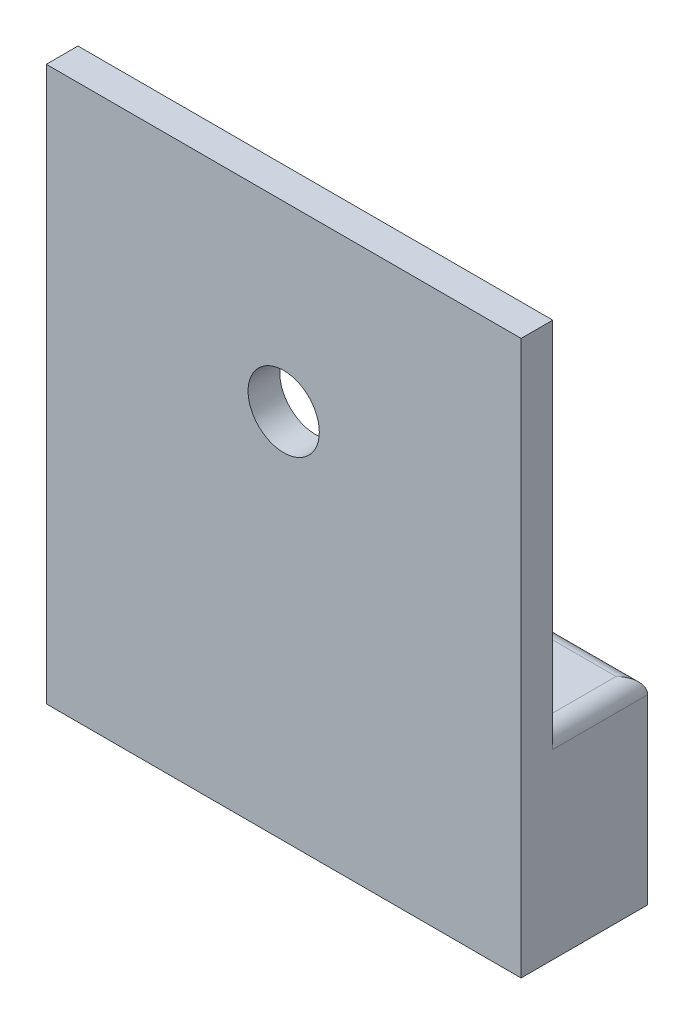
ISO-10303-21;
HEADER;
FILE_DESCRIPTION(('STEP AP214'),'2;1');
FILE_NAME('part.step','',(''),(''),'','','');
FILE_SCHEMA(('AUTOMOTIVE_DESIGN { 1 0 10303 214 1 1 1 1 }'));
ENDSEC;
DATA;
#1=APPLICATION_CONTEXT('core data for automotive mechanical design processes');
#2=APPLICATION_PROTOCOL_DEFINITION('international standard','automotive_design',2000,#1);
#3=PRODUCT_CONTEXT('',#1,'mechanical');
#4=PRODUCT('Part','Part','',(#3));
#5=PRODUCT_RELATED_PRODUCT_CATEGORY('part','',(#4));
#6=PRODUCT_DEFINITION_FORMATION('','',#4);
#7=PRODUCT_DEFINITION_CONTEXT('part definition',#1,'design');
#8=PRODUCT_DEFINITION('design','',#6,#7);
#9=PRODUCT_DEFINITION_SHAPE('','',#8);
#10=(LENGTH_UNIT() NAMED_UNIT(*) SI_UNIT(.MILLI.,.METRE.));
#11=(NAMED_UNIT(*) PLANE_ANGLE_UNIT() SI_UNIT($,.RADIAN.));
#12=(NAMED_UNIT(*) SI_UNIT($,.STERADIAN.) SOLID_ANGLE_UNIT());
#13=UNCERTAINTY_MEASURE_WITH_UNIT(LENGTH_MEASURE(1.E-05),#10,'distance_accuracy_value','');
#14=(GEOMETRIC_REPRESENTATION_CONTEXT(3) GLOBAL_UNCERTAINTY_ASSIGNED_CONTEXT((#13)) GLOBAL_UNIT_ASSIGNED_CONTEXT((#10,
#11,#12)) REPRESENTATION_CONTEXT('',''));
#15=CARTESIAN_POINT('',(0.,0.,0.));
#16=DIRECTION('',(0.,0.,1.));
#17=DIRECTION('',(1.,0.,0.));
#18=AXIS2_PLACEMENT_3D('',#15,#16,#17);
#19=CARTESIAN_POINT('',(0.,0.,4.));
#20=DIRECTION('',(0.,0.,-1.));
#21=DIRECTION('',(-1.,0.,0.));
#22=AXIS2_PLACEMENT_3D('',#19,#20,#21);
#23=PLANE('',#22);
#24=DIRECTION('',(0.,-1.,0.));
#25=VECTOR('',#24,1.);
#26=CARTESIAN_POINT('',(-41.0521449704146,-45.6730769230774,4.));
#27=LINE('',#26,#25);
#28=CARTESIAN_POINT('',(-41.0521449704146,24.3269230769226,4.));
#29=VERTEX_POINT('',#28);
#30=CARTESIAN_POINT('',(-41.0521449704146,-45.6730769230774,4.));
#31=VERTEX_POINT('',#30);
#32=EDGE_CURVE('E150',#29,#31,#27,.T.);
#33=ORIENTED_EDGE('',*,*,#32,.T.);
#34=DIRECTION('',(1.,0.,0.));
#35=VECTOR('',#34,1.);
#36=CARTESIAN_POINT('',(18.9478550295854,-45.6730769230774,4.));
#37=LINE('',#36,#35);
#38=CARTESIAN_POINT('',(18.9478550295854,-45.6730769230774,4.));
#39=VERTEX_POINT('',#38);
#40=EDGE_CURVE('E113',#31,#39,#37,.T.);
#41=ORIENTED_EDGE('',*,*,#40,.T.);
#42=DIRECTION('',(0.,1.,0.));
#43=VECTOR('',#42,1.);
#44=CARTESIAN_POINT('',(18.9478550295854,24.3269230769226,4.));
#45=LINE('',#44,#43);
#46=CARTESIAN_POINT('',(18.9478550295854,24.3269230769226,4.));
#47=VERTEX_POINT('',#46);
#48=EDGE_CURVE('E156',#39,#47,#45,.T.);
#49=ORIENTED_EDGE('',*,*,#48,.T.);
#50=DIRECTION('',(-1.,0.,0.));
#51=VECTOR('',#50,1.);
#52=CARTESIAN_POINT('',(-41.0521449704146,24.3269230769226,4.));
#53=LINE('',#52,#51);
#54=EDGE_CURVE('E159',#47,#29,#53,.T.);
#55=ORIENTED_EDGE('',*,*,#54,.T.);
#56=EDGE_LOOP('',(#33,#41,#49,#55));
#57=FACE_BOUND('',#56,.T.);
#58=CARTESIAN_POINT('',(-11.0521449704146,1.31692307692262,4.));
#59=DIRECTION('',(0.,0.,1.));
#60=DIRECTION('',(1.,0.,0.));
#61=AXIS2_PLACEMENT_3D('',#58,#59,#60);
#62=CIRCLE('',#61,4.5);
#63=CARTESIAN_POINT('',(-6.55214497041455,1.31692307692262,4.));
#64=VERTEX_POINT('',#63);
#65=EDGE_CURVE('E143',#64,#64,#62,.T.);
#66=ORIENTED_EDGE('',*,*,#65,.F.);
#67=EDGE_LOOP('',(#66));
#68=FACE_BOUND('',#67,.T.);
#69=ADVANCED_FACE('F40',(#57,#68),#23,.F.);
#70=CARTESIAN_POINT('',(0.,0.,0.));
#71=DIRECTION('',(0.,0.,-1.));
#72=DIRECTION('',(-1.,0.,0.));
#73=AXIS2_PLACEMENT_3D('',#70,#71,#72);
#74=PLANE('',#73);
#75=DIRECTION('',(1.,0.,0.));
#76=VECTOR('',#75,1.);
#77=CARTESIAN_POINT('',(18.9478550295854,-20.6730769230774,0.));
#78=LINE('',#77,#76);
#79=CARTESIAN_POINT('',(-39.0521449704146,-20.6730769230774,0.));
#80=VERTEX_POINT('',#79);
#81=CARTESIAN_POINT('',(16.9478550295854,-20.6730769230774,0.));
#82=VERTEX_POINT('',#81);
#83=EDGE_CURVE('E131',#80,#82,#78,.T.);
#84=ORIENTED_EDGE('',*,*,#83,.F.);
#85=CARTESIAN_POINT('',(-39.0521449704146,-22.6730769230774,0.));
#86=DIRECTION('',(0.,0.,-1.));
#87=DIRECTION('',(-1.,0.,0.));
#88=AXIS2_PLACEMENT_3D('',#85,#86,#87);
#89=CIRCLE('',#88,2.);
#90=CARTESIAN_POINT('',(-41.0521449704146,-22.6730769230774,0.));
#91=VERTEX_POINT('',#90);
#92=EDGE_CURVE('E11',#80,#91,#89,.F.);
#93=ORIENTED_EDGE('',*,*,#92,.T.);
#94=DIRECTION('',(0.,-1.,0.));
#95=VECTOR('',#94,1.);
#96=CARTESIAN_POINT('',(-41.0521449704146,-45.6730769230774,0.));
#97=LINE('',#96,#95);
#98=CARTESIAN_POINT('',(-41.0521449704146,24.3269230769226,0.));
#99=VERTEX_POINT('',#98);
#100=EDGE_CURVE('E58',#99,#91,#97,.T.);
#101=ORIENTED_EDGE('',*,*,#100,.F.);
#102=DIRECTION('',(-1.,0.,0.));
#103=VECTOR('',#102,1.);
#104=CARTESIAN_POINT('',(-41.0521449704146,24.3269230769226,0.));
#105=LINE('',#104,#103);
#106=CARTESIAN_POINT('',(18.9478550295854,24.3269230769226,0.));
#107=VERTEX_POINT('',#106);
#108=EDGE_CURVE('E153',#107,#99,#105,.T.);
#109=ORIENTED_EDGE('',*,*,#108,.F.);
#110=DIRECTION('',(0.,1.,0.));
#111=VECTOR('',#110,1.);
#112=CARTESIAN_POINT('',(18.9478550295854,24.3269230769226,0.));
#113=LINE('',#112,#111);
#114=CARTESIAN_POINT('',(18.9478550295854,-22.6730769230774,0.));
#115=VERTEX_POINT('',#114);
#116=EDGE_CURVE('E165',#115,#107,#113,.T.);
#117=ORIENTED_EDGE('',*,*,#116,.F.);
#118=CARTESIAN_POINT('',(16.9478550295854,-22.6730769230774,0.));
#119=DIRECTION('',(0.,0.,-1.));
#120=DIRECTION('',(-1.,0.,0.));
#121=AXIS2_PLACEMENT_3D('',#118,#119,#120);
#122=CIRCLE('',#121,2.);
#123=EDGE_CURVE('E50',#115,#82,#122,.F.);
#124=ORIENTED_EDGE('',*,*,#123,.T.);
#125=EDGE_LOOP('',(#84,#93,#101,#109,#117,#124));
#126=FACE_BOUND('',#125,.T.);
#127=CARTESIAN_POINT('',(-11.0521449704146,1.31692307692262,0.));
#128=DIRECTION('',(0.,0.,1.));
#129=DIRECTION('',(1.,0.,0.));
#130=AXIS2_PLACEMENT_3D('',#127,#128,#129);
#131=CIRCLE('',#130,4.5);
#132=CARTESIAN_POINT('',(-6.55214497041455,1.31692307692262,0.));
#133=VERTEX_POINT('',#132);
#134=EDGE_CURVE('E141',#133,#133,#131,.T.);
#135=ORIENTED_EDGE('',*,*,#134,.T.);
#136=EDGE_LOOP('',(#135));
#137=FACE_BOUND('',#136,.T.);
#138=ADVANCED_FACE('F248',(#126,#137),#74,.T.);
#139=CARTESIAN_POINT('',(-41.0521449704146,-45.6730769230774,4.));
#140=DIRECTION('',(1.,0.,0.));
#141=DIRECTION('',(0.,0.,-1.));
#142=AXIS2_PLACEMENT_3D('',#139,#140,#141);
#143=PLANE('',#142);
#144=ORIENTED_EDGE('',*,*,#100,.T.);
#145=DIRECTION('',(0.,0.,1.));
#146=VECTOR('',#145,1.);
#147=CARTESIAN_POINT('',(-41.0521449704146,-22.6730769230774,4.));
#148=LINE('',#147,#146);
#149=CARTESIAN_POINT('',(-41.0521449704146,-22.6730769230774,-12.));
#150=VERTEX_POINT('',#149);
#151=EDGE_CURVE('E62',#91,#150,#148,.F.);
#152=ORIENTED_EDGE('',*,*,#151,.T.);
#153=DIRECTION('',(0.,1.,0.));
#154=VECTOR('',#153,1.);
#155=CARTESIAN_POINT('',(-41.0521449704146,-20.6730769230774,-12.));
#156=LINE('',#155,#154);
#157=CARTESIAN_POINT('',(-41.0521449704146,-45.6730769230774,-12.));
#158=VERTEX_POINT('',#157);
#159=EDGE_CURVE('E120',#158,#150,#156,.T.);
#160=ORIENTED_EDGE('',*,*,#159,.F.);
#161=DIRECTION('',(0.,0.,-1.));
#162=VECTOR('',#161,1.);
#163=CARTESIAN_POINT('',(-41.0521449704146,-45.6730769230774,4.));
#164=LINE('',#163,#162);
#165=EDGE_CURVE('E108',#31,#158,#164,.T.);
#166=ORIENTED_EDGE('',*,*,#165,.F.);
#167=ORIENTED_EDGE('',*,*,#32,.F.);
#168=DIRECTION('',(0.,0.,-1.));
#169=VECTOR('',#168,1.);
#170=CARTESIAN_POINT('',(-41.0521449704146,24.3269230769226,4.));
#171=LINE('',#170,#169);
#172=EDGE_CURVE('E162',#29,#99,#171,.T.);
#173=ORIENTED_EDGE('',*,*,#172,.T.);
#174=EDGE_LOOP('',(#144,#152,#160,#166,#167,#173));
#175=FACE_BOUND('',#174,.T.);
#176=ADVANCED_FACE('F121',(#175),#143,.F.);
#177=CARTESIAN_POINT('',(18.9478550295854,-45.6730769230774,4.));
#178=DIRECTION('',(0.,1.,0.));
#179=DIRECTION('',(0.,0.,1.));
#180=AXIS2_PLACEMENT_3D('',#177,#178,#179);
#181=PLANE('',#180);
#182=CARTESIAN_POINT('',(-29.0521449704145,-45.6730769230774,-4.99999999999999));
#183=DIRECTION('',(0.,1.,0.));
#184=DIRECTION('',(0.,0.,1.));
#185=AXIS2_PLACEMENT_3D('',#182,#183,#184);
#186=CIRCLE('',#185,2.5);
#187=CARTESIAN_POINT('',(-29.0521449704145,-45.6730769230774,-2.5));
#188=VERTEX_POINT('',#187);
#189=EDGE_CURVE('E137',#188,#188,#186,.T.);
#190=ORIENTED_EDGE('',*,*,#189,.T.);
#191=EDGE_LOOP('',(#190));
#192=FACE_BOUND('',#191,.T.);
#193=CARTESIAN_POINT('',(6.94785502958544,-45.6730769230774,-5.));
#194=DIRECTION('',(0.,1.,0.));
#195=DIRECTION('',(0.,0.,1.));
#196=AXIS2_PLACEMENT_3D('',#193,#194,#195);
#197=CIRCLE('',#196,2.5);
#198=CARTESIAN_POINT('',(6.94785502958544,-45.6730769230774,-2.5));
#199=VERTEX_POINT('',#198);
#200=EDGE_CURVE('E207',#199,#199,#197,.T.);
#201=ORIENTED_EDGE('',*,*,#200,.T.);
#202=EDGE_LOOP('',(#201));
#203=FACE_BOUND('',#202,.T.);
#204=ORIENTED_EDGE('',*,*,#165,.T.);
#205=DIRECTION('',(-1.,0.,0.));
#206=VECTOR('',#205,1.);
#207=CARTESIAN_POINT('',(-41.0521449704146,-45.6730769230774,-12.));
#208=LINE('',#207,#206);
#209=CARTESIAN_POINT('',(18.9478550295854,-45.6730769230774,-12.));
#210=VERTEX_POINT('',#209);
#211=EDGE_CURVE('E112',#210,#158,#208,.T.);
#212=ORIENTED_EDGE('',*,*,#211,.F.);
#213=DIRECTION('',(0.,0.,-1.));
#214=VECTOR('',#213,1.);
#215=CARTESIAN_POINT('',(18.9478550295854,-45.6730769230774,4.));
#216=LINE('',#215,#214);
#217=EDGE_CURVE('E118',#39,#210,#216,.T.);
#218=ORIENTED_EDGE('',*,*,#217,.F.);
#219=ORIENTED_EDGE('',*,*,#40,.F.);
#220=EDGE_LOOP('',(#204,#212,#218,#219));
#221=FACE_BOUND('',#220,.T.);
#222=ADVANCED_FACE('F109',(#192,#203,#221),#181,.F.);
#223=CARTESIAN_POINT('',(18.9478550295854,24.3269230769226,4.));
#224=DIRECTION('',(-1.,0.,0.));
#225=DIRECTION('',(0.,0.,1.));
#226=AXIS2_PLACEMENT_3D('',#223,#224,#225);
#227=PLANE('',#226);
#228=DIRECTION('',(0.,-1.,0.));
#229=VECTOR('',#228,1.);
#230=CARTESIAN_POINT('',(18.9478550295854,-45.6730769230774,-12.));
#231=LINE('',#230,#229);
#232=CARTESIAN_POINT('',(18.9478550295854,-22.6730769230774,-12.));
#233=VERTEX_POINT('',#232);
#234=EDGE_CURVE('E125',#233,#210,#231,.T.);
#235=ORIENTED_EDGE('',*,*,#234,.F.);
#236=DIRECTION('',(0.,0.,1.));
#237=VECTOR('',#236,1.);
#238=CARTESIAN_POINT('',(18.9478550295854,-22.6730769230774,4.));
#239=LINE('',#238,#237);
#240=EDGE_CURVE('E117',#233,#115,#239,.T.);
#241=ORIENTED_EDGE('',*,*,#240,.T.);
#242=ORIENTED_EDGE('',*,*,#116,.T.);
#243=DIRECTION('',(0.,0.,-1.));
#244=VECTOR('',#243,1.);
#245=CARTESIAN_POINT('',(18.9478550295854,24.3269230769226,4.));
#246=LINE('',#245,#244);
#247=EDGE_CURVE('E172',#47,#107,#246,.T.);
#248=ORIENTED_EDGE('',*,*,#247,.F.);
#249=ORIENTED_EDGE('',*,*,#48,.F.);
#250=ORIENTED_EDGE('',*,*,#217,.T.);
#251=EDGE_LOOP('',(#235,#241,#242,#248,#249,#250));
#252=FACE_BOUND('',#251,.T.);
#253=ADVANCED_FACE('F241',(#252),#227,.F.);
#254=CARTESIAN_POINT('',(-41.0521449704146,24.3269230769226,4.));
#255=DIRECTION('',(0.,-1.,0.));
#256=DIRECTION('',(0.,0.,-1.));
#257=AXIS2_PLACEMENT_3D('',#254,#255,#256);
#258=PLANE('',#257);
#259=ORIENTED_EDGE('',*,*,#108,.T.);
#260=ORIENTED_EDGE('',*,*,#172,.F.);
#261=ORIENTED_EDGE('',*,*,#54,.F.);
#262=ORIENTED_EDGE('',*,*,#247,.T.);
#263=EDGE_LOOP('',(#259,#260,#261,#262));
#264=FACE_BOUND('',#263,.T.);
#265=ADVANCED_FACE('F253',(#264),#258,.F.);
#266=CARTESIAN_POINT('',(-11.0521449704146,1.31692307692262,4.));
#267=DIRECTION('',(0.,0.,-1.));
#268=DIRECTION('',(-1.,0.,0.));
#269=AXIS2_PLACEMENT_3D('',#266,#267,#268);
#270=CYLINDRICAL_SURFACE('',#269,4.5);
#271=ORIENTED_EDGE('',*,*,#65,.T.);
#272=EDGE_LOOP('',(#271));
#273=FACE_BOUND('',#272,.T.);
#274=ORIENTED_EDGE('',*,*,#134,.F.);
#275=EDGE_LOOP('',(#274));
#276=FACE_BOUND('',#275,.T.);
#277=ADVANCED_FACE('F230',(#273,#276),#270,.F.);
#278=CARTESIAN_POINT('',(18.9478550295854,-20.6730769230774,-12.));
#279=DIRECTION('',(0.,-1.,0.));
#280=DIRECTION('',(0.,0.,-1.));
#281=AXIS2_PLACEMENT_3D('',#278,#279,#280);
#282=PLANE('',#281);
#283=CARTESIAN_POINT('',(-29.0521449704145,-20.6730769230774,-4.99999999999999));
#284=DIRECTION('',(0.,1.,0.));
#285=DIRECTION('',(0.,0.,1.));
#286=AXIS2_PLACEMENT_3D('',#283,#284,#285);
#287=CIRCLE('',#286,2.5);
#288=CARTESIAN_POINT('',(-29.0521449704145,-20.6730769230774,-2.5));
#289=VERTEX_POINT('',#288);
#290=EDGE_CURVE('E212',#289,#289,#287,.T.);
#291=ORIENTED_EDGE('',*,*,#290,.F.);
#292=EDGE_LOOP('',(#291));
#293=FACE_BOUND('',#292,.T.);
#294=CARTESIAN_POINT('',(6.94785502958544,-20.6730769230774,-5.));
#295=DIRECTION('',(0.,1.,0.));
#296=DIRECTION('',(0.,0.,1.));
#297=AXIS2_PLACEMENT_3D('',#294,#295,#296);
#298=CIRCLE('',#297,2.5);
#299=CARTESIAN_POINT('',(6.94785502958544,-20.6730769230774,-2.5));
#300=VERTEX_POINT('',#299);
#301=EDGE_CURVE('E217',#300,#300,#298,.T.);
#302=ORIENTED_EDGE('',*,*,#301,.F.);
#303=EDGE_LOOP('',(#302));
#304=FACE_BOUND('',#303,.T.);
#305=ORIENTED_EDGE('',*,*,#83,.T.);
#306=DIRECTION('',(0.,0.,1.));
#307=VECTOR('',#306,1.);
#308=CARTESIAN_POINT('',(16.9478550295854,-20.6730769230774,-12.));
#309=LINE('',#308,#307);
#310=CARTESIAN_POINT('',(16.9478550295854,-20.6730769230774,-10.));
#311=VERTEX_POINT('',#310);
#312=EDGE_CURVE('E187',#82,#311,#309,.F.);
#313=ORIENTED_EDGE('',*,*,#312,.T.);
#314=DIRECTION('',(1.,0.,0.));
#315=VECTOR('',#314,1.);
#316=CARTESIAN_POINT('',(18.9478550295854,-20.6730769230774,-10.));
#317=LINE('',#316,#315);
#318=CARTESIAN_POINT('',(-39.0521449704146,-20.6730769230774,-10.));
#319=VERTEX_POINT('',#318);
#320=EDGE_CURVE('E181',#311,#319,#317,.F.);
#321=ORIENTED_EDGE('',*,*,#320,.T.);
#322=DIRECTION('',(0.,0.,1.));
#323=VECTOR('',#322,1.);
#324=CARTESIAN_POINT('',(-39.0521449704146,-20.6730769230774,-12.));
#325=LINE('',#324,#323);
#326=EDGE_CURVE('E184',#319,#80,#325,.T.);
#327=ORIENTED_EDGE('',*,*,#326,.T.);
#328=EDGE_LOOP('',(#305,#313,#321,#327));
#329=FACE_BOUND('',#328,.T.);
#330=ADVANCED_FACE('F227',(#293,#304,#329),#282,.F.);
#331=CARTESIAN_POINT('',(0.,0.,-12.));
#332=DIRECTION('',(0.,0.,1.));
#333=DIRECTION('',(1.,0.,0.));
#334=AXIS2_PLACEMENT_3D('',#331,#332,#333);
#335=PLANE('',#334);
#336=ORIENTED_EDGE('',*,*,#159,.T.);
#337=DIRECTION('',(1.,0.,0.));
#338=VECTOR('',#337,1.);
#339=CARTESIAN_POINT('',(0.,-22.6730769230774,-12.));
#340=LINE('',#339,#338);
#341=EDGE_CURVE('E192',#150,#233,#340,.T.);
#342=ORIENTED_EDGE('',*,*,#341,.T.);
#343=ORIENTED_EDGE('',*,*,#234,.T.);
#344=ORIENTED_EDGE('',*,*,#211,.T.);
#345=EDGE_LOOP('',(#336,#342,#343,#344));
#346=FACE_BOUND('',#345,.T.);
#347=ADVANCED_FACE('F127',(#346),#335,.F.);
#348=CARTESIAN_POINT('',(-39.0521449704146,-22.6730769230774,-12.));
#349=DIRECTION('',(0.,0.,1.));
#350=DIRECTION('',(1.,0.,0.));
#351=AXIS2_PLACEMENT_3D('',#348,#349,#350);
#352=CYLINDRICAL_SURFACE('',#351,2.);
#353=ORIENTED_EDGE('',*,*,#92,.F.);
#354=ORIENTED_EDGE('',*,*,#326,.F.);
#355=CARTESIAN_POINT('',(-39.0521449704146,-22.6730769230774,-10.));
#356=DIRECTION('',(0.707106781186547,0.,-0.707106781186547));
#357=DIRECTION('',(0.707106781186547,0.,0.707106781186547));
#358=AXIS2_PLACEMENT_3D('',#355,#356,#357);
#359=ELLIPSE('',#358,2.82842712474619,2.);
#360=EDGE_CURVE('E44',#150,#319,#359,.T.);
#361=ORIENTED_EDGE('',*,*,#360,.F.);
#362=ORIENTED_EDGE('',*,*,#151,.F.);
#363=EDGE_LOOP('',(#353,#354,#361,#362));
#364=FACE_BOUND('',#363,.T.);
#365=ADVANCED_FACE('F42',(#364),#352,.T.);
#366=CARTESIAN_POINT('',(0.,-22.6730769230774,-10.));
#367=DIRECTION('',(1.,0.,0.));
#368=DIRECTION('',(0.,0.,-1.));
#369=AXIS2_PLACEMENT_3D('',#366,#367,#368);
#370=CYLINDRICAL_SURFACE('',#369,2.);
#371=ORIENTED_EDGE('',*,*,#360,.T.);
#372=ORIENTED_EDGE('',*,*,#320,.F.);
#373=CARTESIAN_POINT('',(16.9478550295854,-22.6730769230774,-10.));
#374=DIRECTION('',(0.707106781186547,0.,0.707106781186547));
#375=DIRECTION('',(0.707106781186547,0.,-0.707106781186547));
#376=AXIS2_PLACEMENT_3D('',#373,#374,#375);
#377=ELLIPSE('',#376,2.82842712474619,2.);
#378=EDGE_CURVE('E196',#233,#311,#377,.T.);
#379=ORIENTED_EDGE('',*,*,#378,.F.);
#380=ORIENTED_EDGE('',*,*,#341,.F.);
#381=EDGE_LOOP('',(#371,#372,#379,#380));
#382=FACE_BOUND('',#381,.T.);
#383=ADVANCED_FACE('F246',(#382),#370,.T.);
#384=CARTESIAN_POINT('',(16.9478550295854,-22.6730769230774,4.));
#385=DIRECTION('',(0.,0.,1.));
#386=DIRECTION('',(1.,0.,0.));
#387=AXIS2_PLACEMENT_3D('',#384,#385,#386);
#388=CYLINDRICAL_SURFACE('',#387,2.);
#389=ORIENTED_EDGE('',*,*,#378,.T.);
#390=ORIENTED_EDGE('',*,*,#312,.F.);
#391=ORIENTED_EDGE('',*,*,#123,.F.);
#392=ORIENTED_EDGE('',*,*,#240,.F.);
#393=EDGE_LOOP('',(#389,#390,#391,#392));
#394=FACE_BOUND('',#393,.T.);
#395=ADVANCED_FACE('F239',(#394),#388,.T.);
#396=CARTESIAN_POINT('',(6.94785502958544,-48.6730769230774,-5.));
#397=DIRECTION('',(0.,1.,0.));
#398=DIRECTION('',(0.,0.,1.));
#399=AXIS2_PLACEMENT_3D('',#396,#397,#398);
#400=CYLINDRICAL_SURFACE('',#399,2.5);
#401=ORIENTED_EDGE('',*,*,#301,.T.);
#402=EDGE_LOOP('',(#401));
#403=FACE_BOUND('',#402,.T.);
#404=ORIENTED_EDGE('',*,*,#200,.F.);
#405=EDGE_LOOP('',(#404));
#406=FACE_BOUND('',#405,.T.);
#407=ADVANCED_FACE('F224',(#403,#406),#400,.F.);
#408=CARTESIAN_POINT('',(-29.0521449704145,-48.6730769230774,-4.99999999999999));
#409=DIRECTION('',(0.,1.,0.));
#410=DIRECTION('',(0.,0.,1.));
#411=AXIS2_PLACEMENT_3D('',#408,#409,#410);
#412=CYLINDRICAL_SURFACE('',#411,2.5);
#413=ORIENTED_EDGE('',*,*,#290,.T.);
#414=EDGE_LOOP('',(#413));
#415=FACE_BOUND('',#414,.T.);
#416=ORIENTED_EDGE('',*,*,#189,.F.);
#417=EDGE_LOOP('',(#416));
#418=FACE_BOUND('',#417,.T.);
#419=ADVANCED_FACE('F293',(#415,#418),#412,.F.);
#420=CLOSED_SHELL('',(#69,#138,#176,#222,#253,#265,#277,#330,#347,#365,#383,#395,#407,#419));
#421=MANIFOLD_SOLID_BREP('B2',#420);
#422=ADVANCED_BREP_SHAPE_REPRESENTATION('',(#18,#421),#14);
#423=SHAPE_DEFINITION_REPRESENTATION(#9,#422);
ENDSEC;
END-ISO-10303-21;
